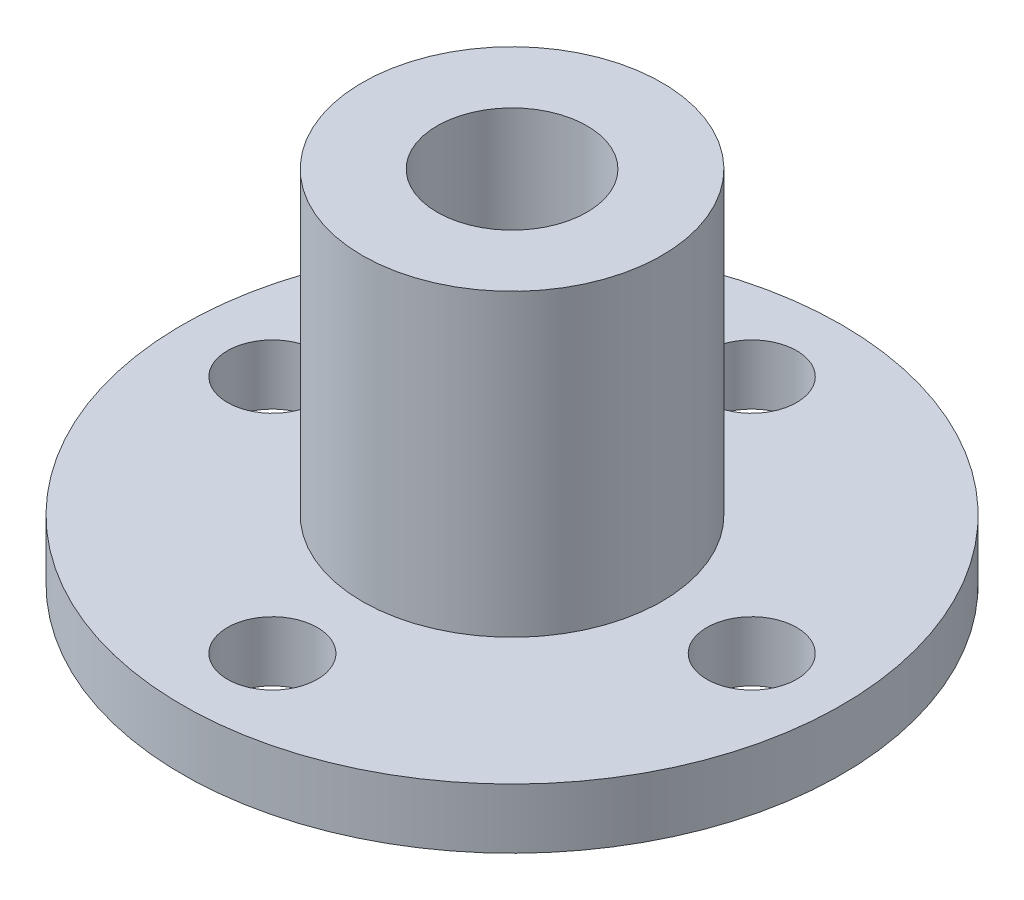
ISO-10303-21;
HEADER;
FILE_DESCRIPTION(('STEP AP214'),'2;1');
FILE_NAME('part.step','',(''),(''),'','','');
FILE_SCHEMA(('AUTOMOTIVE_DESIGN { 1 0 10303 214 1 1 1 1 }'));
ENDSEC;
DATA;
#1=APPLICATION_CONTEXT('core data for automotive mechanical design processes');
#2=APPLICATION_PROTOCOL_DEFINITION('international standard','automotive_design',2000,#1);
#3=PRODUCT_CONTEXT('',#1,'mechanical');
#4=PRODUCT('Part','Part','',(#3));
#5=PRODUCT_RELATED_PRODUCT_CATEGORY('part','',(#4));
#6=PRODUCT_DEFINITION_FORMATION('','',#4);
#7=PRODUCT_DEFINITION_CONTEXT('part definition',#1,'design');
#8=PRODUCT_DEFINITION('design','',#6,#7);
#9=PRODUCT_DEFINITION_SHAPE('','',#8);
#10=(LENGTH_UNIT() NAMED_UNIT(*) SI_UNIT(.MILLI.,.METRE.));
#11=(NAMED_UNIT(*) PLANE_ANGLE_UNIT() SI_UNIT($,.RADIAN.));
#12=(NAMED_UNIT(*) SI_UNIT($,.STERADIAN.) SOLID_ANGLE_UNIT());
#13=UNCERTAINTY_MEASURE_WITH_UNIT(LENGTH_MEASURE(1.E-05),#10,'distance_accuracy_value','');
#14=(GEOMETRIC_REPRESENTATION_CONTEXT(3) GLOBAL_UNCERTAINTY_ASSIGNED_CONTEXT((#13)) GLOBAL_UNIT_ASSIGNED_CONTEXT((#10,
#11,#12)) REPRESENTATION_CONTEXT('',''));
#15=CARTESIAN_POINT('',(0.,0.,0.));
#16=DIRECTION('',(0.,0.,1.));
#17=DIRECTION('',(1.,0.,0.));
#18=AXIS2_PLACEMENT_3D('',#15,#16,#17);
#19=CARTESIAN_POINT('',(0.,10.,0.));
#20=DIRECTION('',(0.,1.,0.));
#21=DIRECTION('',(0.,0.,1.));
#22=AXIS2_PLACEMENT_3D('',#19,#20,#21);
#23=PLANE('',#22);
#24=CARTESIAN_POINT('',(0.,10.,0.));
#25=DIRECTION('',(0.,1.,0.));
#26=DIRECTION('',(0.,0.,1.));
#27=AXIS2_PLACEMENT_3D('',#24,#25,#26);
#28=CIRCLE('',#27,5.);
#29=CARTESIAN_POINT('',(0.,10.,5.));
#30=VERTEX_POINT('',#29);
#31=EDGE_CURVE('E10',#30,#30,#28,.T.);
#32=ORIENTED_EDGE('',*,*,#31,.T.);
#33=EDGE_LOOP('',(#32));
#34=FACE_BOUND('',#33,.T.);
#35=CARTESIAN_POINT('',(0.,10.,0.));
#36=DIRECTION('',(0.,1.,0.));
#37=DIRECTION('',(0.,0.,1.));
#38=AXIS2_PLACEMENT_3D('',#35,#36,#37);
#39=CIRCLE('',#38,2.5);
#40=CARTESIAN_POINT('',(0.,10.,2.5));
#41=VERTEX_POINT('',#40);
#42=EDGE_CURVE('E47',#41,#41,#39,.T.);
#43=ORIENTED_EDGE('',*,*,#42,.F.);
#44=EDGE_LOOP('',(#43));
#45=FACE_BOUND('',#44,.T.);
#46=ADVANCED_FACE('F39',(#34,#45),#23,.T.);
#47=CARTESIAN_POINT('',(0.,10.,0.));
#48=DIRECTION('',(0.,-1.,0.));
#49=DIRECTION('',(0.,0.,-1.));
#50=AXIS2_PLACEMENT_3D('',#47,#48,#49);
#51=CYLINDRICAL_SURFACE('',#50,5.);
#52=ORIENTED_EDGE('',*,*,#31,.F.);
#53=EDGE_LOOP('',(#52));
#54=FACE_BOUND('',#53,.T.);
#55=CARTESIAN_POINT('',(0.,0.,0.));
#56=DIRECTION('',(0.,1.,0.));
#57=DIRECTION('',(0.,0.,1.));
#58=AXIS2_PLACEMENT_3D('',#55,#56,#57);
#59=CIRCLE('',#58,5.);
#60=CARTESIAN_POINT('',(0.,0.,5.));
#61=VERTEX_POINT('',#60);
#62=EDGE_CURVE('E43',#61,#61,#59,.T.);
#63=ORIENTED_EDGE('',*,*,#62,.T.);
#64=EDGE_LOOP('',(#63));
#65=FACE_BOUND('',#64,.T.);
#66=ADVANCED_FACE('F41',(#54,#65),#51,.T.);
#67=CARTESIAN_POINT('',(0.,10.,0.));
#68=DIRECTION('',(0.,-1.,0.));
#69=DIRECTION('',(0.,0.,-1.));
#70=AXIS2_PLACEMENT_3D('',#67,#68,#69);
#71=CYLINDRICAL_SURFACE('',#70,2.5);
#72=ORIENTED_EDGE('',*,*,#42,.T.);
#73=EDGE_LOOP('',(#72));
#74=FACE_BOUND('',#73,.T.);
#75=CARTESIAN_POINT('',(0.,0.,0.));
#76=DIRECTION('',(0.,1.,0.));
#77=DIRECTION('',(0.,0.,1.));
#78=AXIS2_PLACEMENT_3D('',#75,#76,#77);
#79=CIRCLE('',#78,2.5);
#80=CARTESIAN_POINT('',(0.,0.,2.5));
#81=VERTEX_POINT('',#80);
#82=EDGE_CURVE('E51',#81,#81,#79,.T.);
#83=ORIENTED_EDGE('',*,*,#82,.F.);
#84=EDGE_LOOP('',(#83));
#85=FACE_BOUND('',#84,.T.);
#86=ADVANCED_FACE('F109',(#74,#85),#71,.F.);
#87=CARTESIAN_POINT('',(0.,0.,0.));
#88=DIRECTION('',(0.,-1.,0.));
#89=DIRECTION('',(0.,0.,-1.));
#90=AXIS2_PLACEMENT_3D('',#87,#88,#89);
#91=PLANE('',#90);
#92=CARTESIAN_POINT('',(0.,0.,0.));
#93=DIRECTION('',(0.,-1.,0.));
#94=DIRECTION('',(0.,0.,-1.));
#95=AXIS2_PLACEMENT_3D('',#92,#93,#94);
#96=CIRCLE('',#95,1.5);
#97=CARTESIAN_POINT('',(0.,0.,-1.5));
#98=VERTEX_POINT('',#97);
#99=EDGE_CURVE('E87',#98,#98,#96,.T.);
#100=ORIENTED_EDGE('',*,*,#99,.T.);
#101=EDGE_LOOP('',(#100));
#102=FACE_BOUND('',#101,.T.);
#103=ORIENTED_EDGE('',*,*,#82,.T.);
#104=EDGE_LOOP('',(#103));
#105=FACE_BOUND('',#104,.T.);
#106=ADVANCED_FACE('F99',(#102,#105),#91,.F.);
#107=CARTESIAN_POINT('',(0.,-2.,0.));
#108=DIRECTION('',(0.,-1.,0.));
#109=DIRECTION('',(0.,0.,-1.));
#110=AXIS2_PLACEMENT_3D('',#107,#108,#109);
#111=PLANE('',#110);
#112=CARTESIAN_POINT('',(0.,-2.,-8.));
#113=DIRECTION('',(0.,-1.,0.));
#114=DIRECTION('',(0.,0.,1.));
#115=AXIS2_PLACEMENT_3D('',#112,#113,#114);
#116=CIRCLE('',#115,1.5);
#117=CARTESIAN_POINT('',(0.,-2.,-6.5));
#118=VERTEX_POINT('',#117);
#119=EDGE_CURVE('E78',#118,#118,#116,.T.);
#120=ORIENTED_EDGE('',*,*,#119,.F.);
#121=EDGE_LOOP('',(#120));
#122=FACE_BOUND('',#121,.T.);
#123=CARTESIAN_POINT('',(8.,-2.,0.));
#124=DIRECTION('',(0.,-1.,0.));
#125=DIRECTION('',(0.,0.,-1.));
#126=AXIS2_PLACEMENT_3D('',#123,#124,#125);
#127=CIRCLE('',#126,1.5);
#128=CARTESIAN_POINT('',(8.,-2.,-1.5));
#129=VERTEX_POINT('',#128);
#130=EDGE_CURVE('E66',#129,#129,#127,.T.);
#131=ORIENTED_EDGE('',*,*,#130,.F.);
#132=EDGE_LOOP('',(#131));
#133=FACE_BOUND('',#132,.T.);
#134=CARTESIAN_POINT('',(0.,-2.,0.));
#135=DIRECTION('',(0.,-1.,0.));
#136=DIRECTION('',(0.,0.,-1.));
#137=AXIS2_PLACEMENT_3D('',#134,#135,#136);
#138=CIRCLE('',#137,11.);
#139=CARTESIAN_POINT('',(0.,-2.,-11.));
#140=VERTEX_POINT('',#139);
#141=EDGE_CURVE('E59',#140,#140,#138,.T.);
#142=ORIENTED_EDGE('',*,*,#141,.T.);
#143=EDGE_LOOP('',(#142));
#144=FACE_BOUND('',#143,.T.);
#145=CARTESIAN_POINT('',(0.,-2.,8.));
#146=DIRECTION('',(0.,-1.,0.));
#147=DIRECTION('',(0.,0.,-1.));
#148=AXIS2_PLACEMENT_3D('',#145,#146,#147);
#149=CIRCLE('',#148,1.5);
#150=CARTESIAN_POINT('',(0.,-2.,6.5));
#151=VERTEX_POINT('',#150);
#152=EDGE_CURVE('E60',#151,#151,#149,.T.);
#153=ORIENTED_EDGE('',*,*,#152,.F.);
#154=EDGE_LOOP('',(#153));
#155=FACE_BOUND('',#154,.T.);
#156=CARTESIAN_POINT('',(-8.,-2.,0.));
#157=DIRECTION('',(0.,-1.,0.));
#158=DIRECTION('',(0.,0.,1.));
#159=AXIS2_PLACEMENT_3D('',#156,#157,#158);
#160=CIRCLE('',#159,1.5);
#161=CARTESIAN_POINT('',(-8.,-2.,1.5));
#162=VERTEX_POINT('',#161);
#163=EDGE_CURVE('E72',#162,#162,#160,.T.);
#164=ORIENTED_EDGE('',*,*,#163,.F.);
#165=EDGE_LOOP('',(#164));
#166=FACE_BOUND('',#165,.T.);
#167=CARTESIAN_POINT('',(0.,-2.,0.));
#168=DIRECTION('',(0.,-1.,0.));
#169=DIRECTION('',(0.,0.,-1.));
#170=AXIS2_PLACEMENT_3D('',#167,#168,#169);
#171=CIRCLE('',#170,1.5);
#172=CARTESIAN_POINT('',(0.,-2.,-1.5));
#173=VERTEX_POINT('',#172);
#174=EDGE_CURVE('E84',#173,#173,#171,.T.);
#175=ORIENTED_EDGE('',*,*,#174,.F.);
#176=EDGE_LOOP('',(#175));
#177=FACE_BOUND('',#176,.T.);
#178=ADVANCED_FACE('F96',(#122,#133,#144,#155,#166,#177),#111,.T.);
#179=ORIENTED_EDGE('',*,*,#62,.F.);
#180=EDGE_LOOP('',(#179));
#181=FACE_BOUND('',#180,.T.);
#182=CARTESIAN_POINT('',(0.,0.,0.));
#183=DIRECTION('',(0.,-1.,0.));
#184=DIRECTION('',(0.,0.,-1.));
#185=AXIS2_PLACEMENT_3D('',#182,#183,#184);
#186=CIRCLE('',#185,11.);
#187=CARTESIAN_POINT('',(0.,0.,-11.));
#188=VERTEX_POINT('',#187);
#189=EDGE_CURVE('E56',#188,#188,#186,.T.);
#190=ORIENTED_EDGE('',*,*,#189,.F.);
#191=EDGE_LOOP('',(#190));
#192=FACE_BOUND('',#191,.T.);
#193=CARTESIAN_POINT('',(0.,0.,8.));
#194=DIRECTION('',(0.,-1.,0.));
#195=DIRECTION('',(0.,0.,-1.));
#196=AXIS2_PLACEMENT_3D('',#193,#194,#195);
#197=CIRCLE('',#196,1.5);
#198=CARTESIAN_POINT('',(0.,0.,6.5));
#199=VERTEX_POINT('',#198);
#200=EDGE_CURVE('E63',#199,#199,#197,.T.);
#201=ORIENTED_EDGE('',*,*,#200,.T.);
#202=EDGE_LOOP('',(#201));
#203=FACE_BOUND('',#202,.T.);
#204=CARTESIAN_POINT('',(8.,0.,0.));
#205=DIRECTION('',(0.,-1.,0.));
#206=DIRECTION('',(0.,0.,-1.));
#207=AXIS2_PLACEMENT_3D('',#204,#205,#206);
#208=CIRCLE('',#207,1.5);
#209=CARTESIAN_POINT('',(8.,0.,-1.5));
#210=VERTEX_POINT('',#209);
#211=EDGE_CURVE('E69',#210,#210,#208,.T.);
#212=ORIENTED_EDGE('',*,*,#211,.T.);
#213=EDGE_LOOP('',(#212));
#214=FACE_BOUND('',#213,.T.);
#215=CARTESIAN_POINT('',(-8.,0.,0.));
#216=DIRECTION('',(0.,-1.,0.));
#217=DIRECTION('',(0.,0.,1.));
#218=AXIS2_PLACEMENT_3D('',#215,#216,#217);
#219=CIRCLE('',#218,1.5);
#220=CARTESIAN_POINT('',(-8.,0.,1.5));
#221=VERTEX_POINT('',#220);
#222=EDGE_CURVE('E75',#221,#221,#219,.T.);
#223=ORIENTED_EDGE('',*,*,#222,.T.);
#224=EDGE_LOOP('',(#223));
#225=FACE_BOUND('',#224,.T.);
#226=CARTESIAN_POINT('',(0.,0.,-8.));
#227=DIRECTION('',(0.,-1.,0.));
#228=DIRECTION('',(0.,0.,1.));
#229=AXIS2_PLACEMENT_3D('',#226,#227,#228);
#230=CIRCLE('',#229,1.5);
#231=CARTESIAN_POINT('',(0.,0.,-6.5));
#232=VERTEX_POINT('',#231);
#233=EDGE_CURVE('E81',#232,#232,#230,.T.);
#234=ORIENTED_EDGE('',*,*,#233,.T.);
#235=EDGE_LOOP('',(#234));
#236=FACE_BOUND('',#235,.T.);
#237=ADVANCED_FACE('F98',(#181,#192,#203,#214,#225,#236),#91,.F.);
#238=CARTESIAN_POINT('',(0.,-2.,0.));
#239=DIRECTION('',(0.,1.,0.));
#240=DIRECTION('',(0.,0.,1.));
#241=AXIS2_PLACEMENT_3D('',#238,#239,#240);
#242=CYLINDRICAL_SURFACE('',#241,11.);
#243=ORIENTED_EDGE('',*,*,#141,.F.);
#244=EDGE_LOOP('',(#243));
#245=FACE_BOUND('',#244,.T.);
#246=ORIENTED_EDGE('',*,*,#189,.T.);
#247=EDGE_LOOP('',(#246));
#248=FACE_BOUND('',#247,.T.);
#249=ADVANCED_FACE('F106',(#245,#248),#242,.T.);
#250=CARTESIAN_POINT('',(0.,-2.,8.));
#251=DIRECTION('',(0.,1.,0.));
#252=DIRECTION('',(0.,0.,1.));
#253=AXIS2_PLACEMENT_3D('',#250,#251,#252);
#254=CYLINDRICAL_SURFACE('',#253,1.5);
#255=ORIENTED_EDGE('',*,*,#152,.T.);
#256=EDGE_LOOP('',(#255));
#257=FACE_BOUND('',#256,.T.);
#258=ORIENTED_EDGE('',*,*,#200,.F.);
#259=EDGE_LOOP('',(#258));
#260=FACE_BOUND('',#259,.T.);
#261=ADVANCED_FACE('F125',(#257,#260),#254,.F.);
#262=CARTESIAN_POINT('',(8.,-2.,0.));
#263=DIRECTION('',(0.,1.,0.));
#264=DIRECTION('',(0.,0.,1.));
#265=AXIS2_PLACEMENT_3D('',#262,#263,#264);
#266=CYLINDRICAL_SURFACE('',#265,1.5);
#267=ORIENTED_EDGE('',*,*,#130,.T.);
#268=EDGE_LOOP('',(#267));
#269=FACE_BOUND('',#268,.T.);
#270=ORIENTED_EDGE('',*,*,#211,.F.);
#271=EDGE_LOOP('',(#270));
#272=FACE_BOUND('',#271,.T.);
#273=ADVANCED_FACE('F130',(#269,#272),#266,.F.);
#274=CARTESIAN_POINT('',(-8.,-2.,0.));
#275=DIRECTION('',(0.,1.,0.));
#276=DIRECTION('',(0.,0.,1.));
#277=AXIS2_PLACEMENT_3D('',#274,#275,#276);
#278=CYLINDRICAL_SURFACE('',#277,1.5);
#279=ORIENTED_EDGE('',*,*,#163,.T.);
#280=EDGE_LOOP('',(#279));
#281=FACE_BOUND('',#280,.T.);
#282=ORIENTED_EDGE('',*,*,#222,.F.);
#283=EDGE_LOOP('',(#282));
#284=FACE_BOUND('',#283,.T.);
#285=ADVANCED_FACE('F147',(#281,#284),#278,.F.);
#286=CARTESIAN_POINT('',(0.,-2.,-8.));
#287=DIRECTION('',(0.,1.,0.));
#288=DIRECTION('',(0.,0.,1.));
#289=AXIS2_PLACEMENT_3D('',#286,#287,#288);
#290=CYLINDRICAL_SURFACE('',#289,1.5);
#291=ORIENTED_EDGE('',*,*,#119,.T.);
#292=EDGE_LOOP('',(#291));
#293=FACE_BOUND('',#292,.T.);
#294=ORIENTED_EDGE('',*,*,#233,.F.);
#295=EDGE_LOOP('',(#294));
#296=FACE_BOUND('',#295,.T.);
#297=ADVANCED_FACE('F145',(#293,#296),#290,.F.);
#298=CARTESIAN_POINT('',(0.,-2.,0.));
#299=DIRECTION('',(0.,1.,0.));
#300=DIRECTION('',(0.,0.,1.));
#301=AXIS2_PLACEMENT_3D('',#298,#299,#300);
#302=CYLINDRICAL_SURFACE('',#301,1.5);
#303=ORIENTED_EDGE('',*,*,#174,.T.);
#304=EDGE_LOOP('',(#303));
#305=FACE_BOUND('',#304,.T.);
#306=ORIENTED_EDGE('',*,*,#99,.F.);
#307=EDGE_LOOP('',(#306));
#308=FACE_BOUND('',#307,.T.);
#309=ADVANCED_FACE('F93',(#305,#308),#302,.F.);
#310=CLOSED_SHELL('',(#46,#66,#86,#106,#178,#237,#249,#261,#273,#285,#297,#309));
#311=MANIFOLD_SOLID_BREP('B2',#310);
#312=ADVANCED_BREP_SHAPE_REPRESENTATION('',(#18,#311),#14);
#313=SHAPE_DEFINITION_REPRESENTATION(#9,#312);
ENDSEC;
END-ISO-10303-21;
